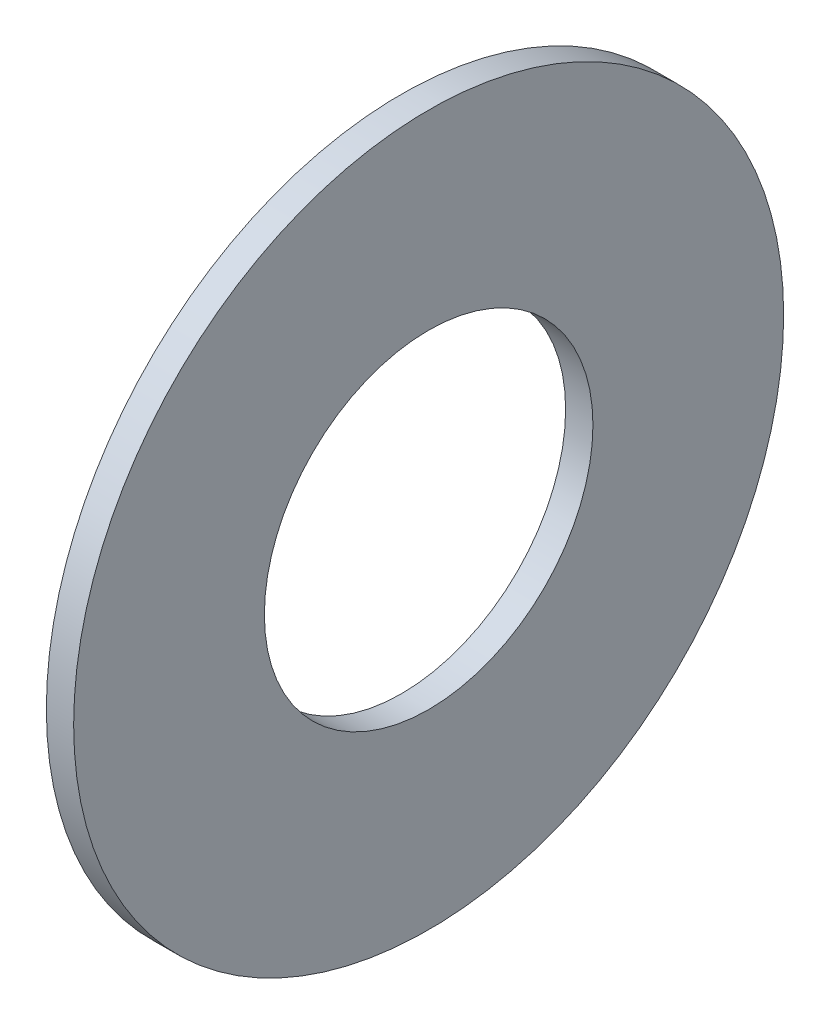
ISO-10303-21;
HEADER;
FILE_DESCRIPTION(('STEP AP214'),'2;1');
FILE_NAME('part.step','',(''),(''),'','','');
FILE_SCHEMA(('AUTOMOTIVE_DESIGN { 1 0 10303 214 1 1 1 1 }'));
ENDSEC;
DATA;
#1=APPLICATION_CONTEXT('core data for automotive mechanical design processes');
#2=APPLICATION_PROTOCOL_DEFINITION('international standard','automotive_design',2000,#1);
#3=PRODUCT_CONTEXT('',#1,'mechanical');
#4=PRODUCT('Part','Part','',(#3));
#5=PRODUCT_RELATED_PRODUCT_CATEGORY('part','',(#4));
#6=PRODUCT_DEFINITION_FORMATION('','',#4);
#7=PRODUCT_DEFINITION_CONTEXT('part definition',#1,'design');
#8=PRODUCT_DEFINITION('design','',#6,#7);
#9=PRODUCT_DEFINITION_SHAPE('','',#8);
#10=(LENGTH_UNIT() NAMED_UNIT(*) SI_UNIT(.MILLI.,.METRE.));
#11=(NAMED_UNIT(*) PLANE_ANGLE_UNIT() SI_UNIT($,.RADIAN.));
#12=(NAMED_UNIT(*) SI_UNIT($,.STERADIAN.) SOLID_ANGLE_UNIT());
#13=UNCERTAINTY_MEASURE_WITH_UNIT(LENGTH_MEASURE(1.E-05),#10,'distance_accuracy_value','');
#14=(GEOMETRIC_REPRESENTATION_CONTEXT(3) GLOBAL_UNCERTAINTY_ASSIGNED_CONTEXT((#13)) GLOBAL_UNIT_ASSIGNED_CONTEXT((#10,
#11,#12)) REPRESENTATION_CONTEXT('',''));
#15=CARTESIAN_POINT('',(0.,0.,0.));
#16=DIRECTION('',(0.,0.,1.));
#17=DIRECTION('',(1.,0.,0.));
#18=AXIS2_PLACEMENT_3D('',#15,#16,#17);
#19=CARTESIAN_POINT('',(0.499999999999975,0.,0.));
#20=DIRECTION('',(1.,0.,0.));
#21=DIRECTION('',(0.,0.,-1.));
#22=AXIS2_PLACEMENT_3D('',#19,#20,#21);
#23=PLANE('',#22);
#24=CARTESIAN_POINT('',(0.499999999999975,0.,0.));
#25=DIRECTION('',(1.,0.,0.));
#26=DIRECTION('',(0.,0.,-1.));
#27=AXIS2_PLACEMENT_3D('',#24,#25,#26);
#28=CIRCLE('',#27,13.);
#29=CARTESIAN_POINT('',(0.499999999999975,0.,-13.));
#30=VERTEX_POINT('',#29);
#31=EDGE_CURVE('E10',#30,#30,#28,.T.);
#32=ORIENTED_EDGE('',*,*,#31,.T.);
#33=EDGE_LOOP('',(#32));
#34=FACE_BOUND('',#33,.T.);
#35=CARTESIAN_POINT('',(0.499999999999975,0.,0.));
#36=DIRECTION('',(1.,0.,0.));
#37=DIRECTION('',(0.,0.,-1.));
#38=AXIS2_PLACEMENT_3D('',#35,#36,#37);
#39=CIRCLE('',#38,6.016);
#40=CARTESIAN_POINT('',(0.499999999999975,0.,-6.016));
#41=VERTEX_POINT('',#40);
#42=EDGE_CURVE('E44',#41,#41,#39,.T.);
#43=ORIENTED_EDGE('',*,*,#42,.F.);
#44=EDGE_LOOP('',(#43));
#45=FACE_BOUND('',#44,.T.);
#46=ADVANCED_FACE('F37',(#34,#45),#23,.T.);
#47=CARTESIAN_POINT('',(0.499999999999975,0.,0.));
#48=DIRECTION('',(-1.,0.,0.));
#49=DIRECTION('',(0.,0.,1.));
#50=AXIS2_PLACEMENT_3D('',#47,#48,#49);
#51=CYLINDRICAL_SURFACE('',#50,13.);
#52=ORIENTED_EDGE('',*,*,#31,.F.);
#53=EDGE_LOOP('',(#52));
#54=FACE_BOUND('',#53,.T.);
#55=CARTESIAN_POINT('',(-0.500000000000025,0.,0.));
#56=DIRECTION('',(1.,0.,0.));
#57=DIRECTION('',(0.,0.,-1.));
#58=AXIS2_PLACEMENT_3D('',#55,#56,#57);
#59=CIRCLE('',#58,13.);
#60=CARTESIAN_POINT('',(-0.500000000000025,0.,-13.));
#61=VERTEX_POINT('',#60);
#62=EDGE_CURVE('E48',#61,#61,#59,.T.);
#63=ORIENTED_EDGE('',*,*,#62,.T.);
#64=EDGE_LOOP('',(#63));
#65=FACE_BOUND('',#64,.T.);
#66=ADVANCED_FACE('F39',(#54,#65),#51,.T.);
#67=CARTESIAN_POINT('',(0.499999999999975,0.,0.));
#68=DIRECTION('',(-1.,0.,0.));
#69=DIRECTION('',(0.,0.,1.));
#70=AXIS2_PLACEMENT_3D('',#67,#68,#69);
#71=CYLINDRICAL_SURFACE('',#70,6.016);
#72=ORIENTED_EDGE('',*,*,#42,.T.);
#73=EDGE_LOOP('',(#72));
#74=FACE_BOUND('',#73,.T.);
#75=CARTESIAN_POINT('',(-0.500000000000025,0.,0.));
#76=DIRECTION('',(1.,0.,0.));
#77=DIRECTION('',(0.,0.,-1.));
#78=AXIS2_PLACEMENT_3D('',#75,#76,#77);
#79=CIRCLE('',#78,6.016);
#80=CARTESIAN_POINT('',(-0.500000000000025,0.,-6.016));
#81=VERTEX_POINT('',#80);
#82=EDGE_CURVE('E52',#81,#81,#79,.T.);
#83=ORIENTED_EDGE('',*,*,#82,.F.);
#84=EDGE_LOOP('',(#83));
#85=FACE_BOUND('',#84,.T.);
#86=ADVANCED_FACE('F61',(#74,#85),#71,.F.);
#87=CARTESIAN_POINT('',(-0.500000000000025,0.,0.));
#88=DIRECTION('',(1.,0.,0.));
#89=DIRECTION('',(0.,0.,-1.));
#90=AXIS2_PLACEMENT_3D('',#87,#88,#89);
#91=PLANE('',#90);
#92=ORIENTED_EDGE('',*,*,#82,.T.);
#93=EDGE_LOOP('',(#92));
#94=FACE_BOUND('',#93,.T.);
#95=ORIENTED_EDGE('',*,*,#62,.F.);
#96=EDGE_LOOP('',(#95));
#97=FACE_BOUND('',#96,.T.);
#98=ADVANCED_FACE('F58',(#94,#97),#91,.F.);
#99=CLOSED_SHELL('',(#46,#66,#86,#98));
#100=MANIFOLD_SOLID_BREP('B2',#99);
#101=ADVANCED_BREP_SHAPE_REPRESENTATION('',(#18,#100),#14);
#102=SHAPE_DEFINITION_REPRESENTATION(#9,#101);
ENDSEC;
END-ISO-10303-21;
